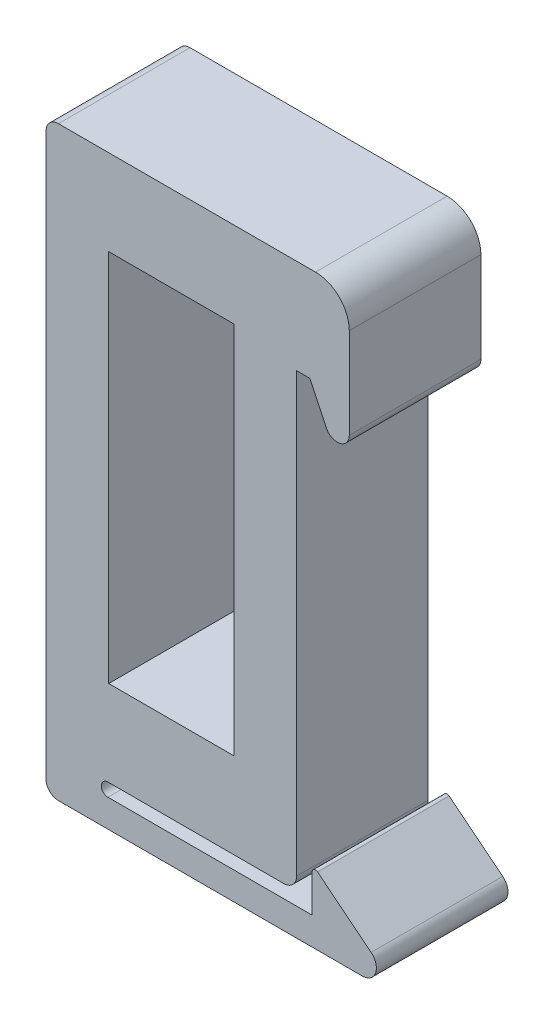
ISO-10303-21;
HEADER;
FILE_DESCRIPTION(('STEP AP214'),'2;1');
FILE_NAME('part.step','',(''),(''),'','','');
FILE_SCHEMA(('AUTOMOTIVE_DESIGN { 1 0 10303 214 1 1 1 1 }'));
ENDSEC;
DATA;
#1=APPLICATION_CONTEXT('core data for automotive mechanical design processes');
#2=APPLICATION_PROTOCOL_DEFINITION('international standard','automotive_design',2000,#1);
#3=PRODUCT_CONTEXT('',#1,'mechanical');
#4=PRODUCT('Part','Part','',(#3));
#5=PRODUCT_RELATED_PRODUCT_CATEGORY('part','',(#4));
#6=PRODUCT_DEFINITION_FORMATION('','',#4);
#7=PRODUCT_DEFINITION_CONTEXT('part definition',#1,'design');
#8=PRODUCT_DEFINITION('design','',#6,#7);
#9=PRODUCT_DEFINITION_SHAPE('','',#8);
#10=(LENGTH_UNIT() NAMED_UNIT(*) SI_UNIT(.MILLI.,.METRE.));
#11=(NAMED_UNIT(*) PLANE_ANGLE_UNIT() SI_UNIT($,.RADIAN.));
#12=(NAMED_UNIT(*) SI_UNIT($,.STERADIAN.) SOLID_ANGLE_UNIT());
#13=UNCERTAINTY_MEASURE_WITH_UNIT(LENGTH_MEASURE(1.E-05),#10,'distance_accuracy_value','');
#14=(GEOMETRIC_REPRESENTATION_CONTEXT(3) GLOBAL_UNCERTAINTY_ASSIGNED_CONTEXT((#13)) GLOBAL_UNIT_ASSIGNED_CONTEXT((#10,
#11,#12)) REPRESENTATION_CONTEXT('',''));
#15=CARTESIAN_POINT('',(0.,0.,0.));
#16=DIRECTION('',(0.,0.,1.));
#17=DIRECTION('',(1.,0.,0.));
#18=AXIS2_PLACEMENT_3D('',#15,#16,#17);
#19=CARTESIAN_POINT('',(49.7811740950623,18.6668074992488,10.));
#20=DIRECTION('',(0.,0.,-1.));
#21=DIRECTION('',(-1.,0.,0.));
#22=AXIS2_PLACEMENT_3D('',#19,#20,#21);
#23=PLANE('',#22);
#24=CARTESIAN_POINT('',(49.7811740950623,18.6668074992488,10.));
#25=DIRECTION('',(0.,0.,1.));
#26=DIRECTION('',(-1.,0.,0.));
#27=AXIS2_PLACEMENT_3D('',#24,#25,#26);
#28=CIRCLE('',#27,2.56766509573083);
#29=CARTESIAN_POINT('',(52.3488391907931,18.6668074992488,10.));
#30=VERTEX_POINT('',#29);
#31=CARTESIAN_POINT('',(49.7811740950623,21.2344725949797,10.));
#32=VERTEX_POINT('',#31);
#33=EDGE_CURVE('E226',#30,#32,#28,.T.);
#34=ORIENTED_EDGE('',*,*,#33,.T.);
#35=DIRECTION('',(-1.,0.,0.));
#36=VECTOR('',#35,1.);
#37=CARTESIAN_POINT('',(49.7811740950623,21.2344725949797,10.));
#38=LINE('',#37,#36);
#39=CARTESIAN_POINT('',(30.2464223580135,21.2344725949797,10.));
#40=VERTEX_POINT('',#39);
#41=EDGE_CURVE('E229',#32,#40,#38,.T.);
#42=ORIENTED_EDGE('',*,*,#41,.T.);
#43=CARTESIAN_POINT('',(30.2464223580134,20.2944725949797,10.));
#44=DIRECTION('',(0.,0.,1.));
#45=DIRECTION('',(-1.,0.,0.));
#46=AXIS2_PLACEMENT_3D('',#43,#44,#45);
#47=CIRCLE('',#46,0.94);
#48=CARTESIAN_POINT('',(29.3064223580134,20.2944725949797,10.));
#49=VERTEX_POINT('',#48);
#50=EDGE_CURVE('E232',#40,#49,#47,.T.);
#51=ORIENTED_EDGE('',*,*,#50,.T.);
#52=DIRECTION('',(0.,-1.,0.));
#53=VECTOR('',#52,1.);
#54=CARTESIAN_POINT('',(29.3064223580134,-22.3695921607389,10.));
#55=LINE('',#54,#53);
#56=CARTESIAN_POINT('',(29.3064223580134,-22.3695921607389,10.));
#57=VERTEX_POINT('',#56);
#58=EDGE_CURVE('E234',#49,#57,#55,.T.);
#59=ORIENTED_EDGE('',*,*,#58,.T.);
#60=CARTESIAN_POINT('',(30.2464223580135,-22.3695921607389,10.));
#61=DIRECTION('',(0.,0.,1.));
#62=DIRECTION('',(-1.,0.,0.));
#63=AXIS2_PLACEMENT_3D('',#60,#61,#62);
#64=CIRCLE('',#63,0.940000000000002);
#65=CARTESIAN_POINT('',(30.2464223580135,-23.3095921607389,10.));
#66=VERTEX_POINT('',#65);
#67=EDGE_CURVE('E236',#57,#66,#64,.T.);
#68=ORIENTED_EDGE('',*,*,#67,.T.);
#69=DIRECTION('',(1.,0.,0.));
#70=VECTOR('',#69,1.);
#71=CARTESIAN_POINT('',(53.3430401779348,-23.3095921607389,10.));
#72=LINE('',#71,#70);
#73=CARTESIAN_POINT('',(53.3430401779348,-23.3095921607389,10.));
#74=VERTEX_POINT('',#73);
#75=EDGE_CURVE('E238',#66,#74,#72,.T.);
#76=ORIENTED_EDGE('',*,*,#75,.T.);
#77=CARTESIAN_POINT('',(53.3430401779348,-22.245509760747,10.));
#78=DIRECTION('',(0.,0.,1.));
#79=DIRECTION('',(1.,0.,0.));
#80=AXIS2_PLACEMENT_3D('',#77,#78,#79);
#81=CIRCLE('',#80,1.06408239999195);
#82=CARTESIAN_POINT('',(54.0077665239454,-21.4146004763531,10.));
#83=VERTEX_POINT('',#82);
#84=EDGE_CURVE('E240',#74,#83,#81,.T.);
#85=ORIENTED_EDGE('',*,*,#84,.T.);
#86=DIRECTION('',(-0.780869305234418,0.624694427814686,0.));
#87=VECTOR('',#86,1.);
#88=CARTESIAN_POINT('',(54.0077665239454,-21.4146004763531,10.));
#89=LINE('',#88,#87);
#90=CARTESIAN_POINT('',(49.9373464974863,-18.1582697532099,10.));
#91=VERTEX_POINT('',#90);
#92=EDGE_CURVE('E242',#83,#91,#89,.T.);
#93=ORIENTED_EDGE('',*,*,#92,.T.);
#94=CARTESIAN_POINT('',(49.7811740950623,-18.3534855738539,10.));
#95=DIRECTION('',(0.,0.,1.));
#96=DIRECTION('',(-1.,0.,0.));
#97=AXIS2_PLACEMENT_3D('',#94,#95,#96);
#98=CIRCLE('',#97,0.249998071809792);
#99=CARTESIAN_POINT('',(49.5311760232525,-18.3534855738539,10.));
#100=VERTEX_POINT('',#99);
#101=EDGE_CURVE('E244',#91,#100,#98,.T.);
#102=ORIENTED_EDGE('',*,*,#101,.T.);
#103=DIRECTION('',(0.,-1.,0.));
#104=VECTOR('',#103,1.);
#105=CARTESIAN_POINT('',(49.5311760232525,-21.2061947275771,10.));
#106=LINE('',#105,#104);
#107=CARTESIAN_POINT('',(49.5311760232525,-21.2061947275771,10.));
#108=VERTEX_POINT('',#107);
#109=EDGE_CURVE('E246',#100,#108,#106,.T.);
#110=ORIENTED_EDGE('',*,*,#109,.T.);
#111=DIRECTION('',(-1.,0.,0.));
#112=VECTOR('',#111,1.);
#113=CARTESIAN_POINT('',(49.5311760232525,-21.2061947275771,10.));
#114=LINE('',#113,#112);
#115=CARTESIAN_POINT('',(34.0066171767922,-21.2061947275771,10.));
#116=VERTEX_POINT('',#115);
#117=EDGE_CURVE('E248',#108,#116,#114,.T.);
#118=ORIENTED_EDGE('',*,*,#117,.T.);
#119=CARTESIAN_POINT('',(34.0066171767922,-20.7061957275771,10.));
#120=DIRECTION('',(0.,0.,-1.));
#121=DIRECTION('',(1.,0.,0.));
#122=AXIS2_PLACEMENT_3D('',#119,#120,#121);
#123=CIRCLE('',#122,0.499999000000004);
#124=CARTESIAN_POINT('',(34.0066171767922,-20.2061967275771,10.));
#125=VERTEX_POINT('',#124);
#126=EDGE_CURVE('E250',#116,#125,#123,.T.);
#127=ORIENTED_EDGE('',*,*,#126,.T.);
#128=DIRECTION('',(1.,0.,0.));
#129=VECTOR('',#128,1.);
#130=CARTESIAN_POINT('',(34.0066171767922,-20.2061967275771,10.));
#131=LINE('',#130,#129);
#132=CARTESIAN_POINT('',(47.3688391907911,-20.2061967275771,10.));
#133=VERTEX_POINT('',#132);
#134=EDGE_CURVE('E252',#125,#133,#131,.T.);
#135=ORIENTED_EDGE('',*,*,#134,.T.);
#136=CARTESIAN_POINT('',(47.3688391907911,-19.226196727576,10.));
#137=DIRECTION('',(0.,0.,1.));
#138=DIRECTION('',(1.,0.,0.));
#139=AXIS2_PLACEMENT_3D('',#136,#137,#138);
#140=CIRCLE('',#139,0.980000000001027);
#141=CARTESIAN_POINT('',(48.3488391907921,-19.226196727576,10.));
#142=VERTEX_POINT('',#141);
#143=EDGE_CURVE('E254',#133,#142,#140,.T.);
#144=ORIENTED_EDGE('',*,*,#143,.T.);
#145=DIRECTION('',(0.,1.,0.));
#146=VECTOR('',#145,1.);
#147=CARTESIAN_POINT('',(48.3488391907921,-19.226196727576,10.));
#148=LINE('',#147,#146);
#149=CARTESIAN_POINT('',(48.3488391907921,14.0313691365042,10.));
#150=VERTEX_POINT('',#149);
#151=EDGE_CURVE('E256',#142,#150,#148,.T.);
#152=ORIENTED_EDGE('',*,*,#151,.T.);
#153=DIRECTION('',(1.,0.,0.));
#154=VECTOR('',#153,1.);
#155=CARTESIAN_POINT('',(48.3488391907921,14.0313691365042,10.));
#156=LINE('',#155,#154);
#157=CARTESIAN_POINT('',(49.348838236102,14.0313691365042,10.));
#158=VERTEX_POINT('',#157);
#159=EDGE_CURVE('E258',#150,#158,#156,.T.);
#160=ORIENTED_EDGE('',*,*,#159,.T.);
#161=DIRECTION('',(0.430782593646307,-0.90245573687099,0.));
#162=VECTOR('',#161,1.);
#163=CARTESIAN_POINT('',(49.348838236102,14.0313691365042,10.));
#164=LINE('',#163,#162);
#165=CARTESIAN_POINT('',(50.6107328158839,11.3877989931256,10.));
#166=VERTEX_POINT('',#165);
#167=EDGE_CURVE('E260',#158,#166,#164,.T.);
#168=ORIENTED_EDGE('',*,*,#167,.T.);
#169=CARTESIAN_POINT('',(51.4352271990798,11.7813671365022,10.));
#170=DIRECTION('',(0.,0.,1.));
#171=DIRECTION('',(1.,0.,0.));
#172=AXIS2_PLACEMENT_3D('',#169,#170,#171);
#173=CIRCLE('',#172,0.91361199171337);
#174=CARTESIAN_POINT('',(52.3488391907931,11.7813671365022,10.));
#175=VERTEX_POINT('',#174);
#176=EDGE_CURVE('E262',#166,#175,#173,.T.);
#177=ORIENTED_EDGE('',*,*,#176,.T.);
#178=DIRECTION('',(0.,1.,0.));
#179=VECTOR('',#178,1.);
#180=CARTESIAN_POINT('',(52.3488391907931,18.6668074992488,10.));
#181=LINE('',#180,#179);
#182=EDGE_CURVE('E264',#175,#30,#181,.T.);
#183=ORIENTED_EDGE('',*,*,#182,.T.);
#184=EDGE_LOOP('',(#34,#42,#51,#59,#68,#76,#85,#93,#102,#110,#118,#127,#135,#144,#152,#160,#168,
#177,#183));
#185=FACE_BOUND('',#184,.T.);
#186=DIRECTION('',(0.,1.,0.));
#187=VECTOR('',#186,1.);
#188=CARTESIAN_POINT('',(43.5863391907921,-13.6944765462048,10.));
#189=LINE('',#188,#187);
#190=CARTESIAN_POINT('',(43.5863391907921,-13.6944765462048,10.));
#191=VERTEX_POINT('',#190);
#192=CARTESIAN_POINT('',(43.5863391907921,14.7244725949797,10.));
#193=VERTEX_POINT('',#192);
#194=EDGE_CURVE('E188',#191,#193,#189,.T.);
#195=ORIENTED_EDGE('',*,*,#194,.F.);
#196=DIRECTION('',(1.,0.,0.));
#197=VECTOR('',#196,1.);
#198=CARTESIAN_POINT('',(34.0689223580134,-13.6944765462048,10.));
#199=LINE('',#198,#197);
#200=CARTESIAN_POINT('',(34.0689223580134,-13.6944765462048,10.));
#201=VERTEX_POINT('',#200);
#202=EDGE_CURVE('E210',#201,#191,#199,.T.);
#203=ORIENTED_EDGE('',*,*,#202,.F.);
#204=DIRECTION('',(0.,-1.,0.));
#205=VECTOR('',#204,1.);
#206=CARTESIAN_POINT('',(34.0689223580134,-13.6944765462048,10.));
#207=LINE('',#206,#205);
#208=CARTESIAN_POINT('',(34.0689223580134,14.7244725949797,10.));
#209=VERTEX_POINT('',#208);
#210=EDGE_CURVE('E208',#209,#201,#207,.T.);
#211=ORIENTED_EDGE('',*,*,#210,.F.);
#212=DIRECTION('',(-1.,0.,0.));
#213=VECTOR('',#212,1.);
#214=CARTESIAN_POINT('',(34.0689223580134,14.7244725949797,10.));
#215=LINE('',#214,#213);
#216=EDGE_CURVE('E196',#193,#209,#215,.T.);
#217=ORIENTED_EDGE('',*,*,#216,.F.);
#218=EDGE_LOOP('',(#195,#203,#211,#217));
#219=FACE_BOUND('',#218,.T.);
#220=ADVANCED_FACE('F33',(#185,#219),#23,.F.);
#221=CARTESIAN_POINT('',(49.7811740950623,18.6668074992488,0.));
#222=DIRECTION('',(0.,0.,-1.));
#223=DIRECTION('',(-1.,0.,0.));
#224=AXIS2_PLACEMENT_3D('',#221,#222,#223);
#225=PLANE('',#224);
#226=CARTESIAN_POINT('',(49.7811740950623,18.6668074992488,0.));
#227=DIRECTION('',(0.,0.,1.));
#228=DIRECTION('',(-1.,0.,0.));
#229=AXIS2_PLACEMENT_3D('',#226,#227,#228);
#230=CIRCLE('',#229,2.56766509573083);
#231=CARTESIAN_POINT('',(52.3488391907931,18.6668074992488,0.));
#232=VERTEX_POINT('',#231);
#233=CARTESIAN_POINT('',(49.7811740950623,21.2344725949797,0.));
#234=VERTEX_POINT('',#233);
#235=EDGE_CURVE('E204',#232,#234,#230,.T.);
#236=ORIENTED_EDGE('',*,*,#235,.F.);
#237=DIRECTION('',(0.,1.,0.));
#238=VECTOR('',#237,1.);
#239=CARTESIAN_POINT('',(52.3488391907931,18.6668074992488,0.));
#240=LINE('',#239,#238);
#241=CARTESIAN_POINT('',(52.3488391907931,11.7813671365022,0.));
#242=VERTEX_POINT('',#241);
#243=EDGE_CURVE('E230',#242,#232,#240,.T.);
#244=ORIENTED_EDGE('',*,*,#243,.F.);
#245=CARTESIAN_POINT('',(51.4352271990798,11.7813671365022,0.));
#246=DIRECTION('',(0.,0.,1.));
#247=DIRECTION('',(1.,0.,0.));
#248=AXIS2_PLACEMENT_3D('',#245,#246,#247);
#249=CIRCLE('',#248,0.91361199171337);
#250=CARTESIAN_POINT('',(50.6107328158839,11.3877989931256,0.));
#251=VERTEX_POINT('',#250);
#252=EDGE_CURVE('E301',#251,#242,#249,.T.);
#253=ORIENTED_EDGE('',*,*,#252,.F.);
#254=DIRECTION('',(0.430782593646307,-0.90245573687099,0.));
#255=VECTOR('',#254,1.);
#256=CARTESIAN_POINT('',(49.348838236102,14.0313691365042,0.));
#257=LINE('',#256,#255);
#258=CARTESIAN_POINT('',(49.348838236102,14.0313691365042,0.));
#259=VERTEX_POINT('',#258);
#260=EDGE_CURVE('E299',#259,#251,#257,.T.);
#261=ORIENTED_EDGE('',*,*,#260,.F.);
#262=DIRECTION('',(1.,0.,0.));
#263=VECTOR('',#262,1.);
#264=CARTESIAN_POINT('',(48.3488391907921,14.0313691365042,0.));
#265=LINE('',#264,#263);
#266=CARTESIAN_POINT('',(48.3488391907921,14.0313691365042,0.));
#267=VERTEX_POINT('',#266);
#268=EDGE_CURVE('E297',#267,#259,#265,.T.);
#269=ORIENTED_EDGE('',*,*,#268,.F.);
#270=DIRECTION('',(0.,1.,0.));
#271=VECTOR('',#270,1.);
#272=CARTESIAN_POINT('',(48.3488391907921,-19.226196727576,0.));
#273=LINE('',#272,#271);
#274=CARTESIAN_POINT('',(48.3488391907921,-19.226196727576,0.));
#275=VERTEX_POINT('',#274);
#276=EDGE_CURVE('E295',#275,#267,#273,.T.);
#277=ORIENTED_EDGE('',*,*,#276,.F.);
#278=CARTESIAN_POINT('',(47.3688391907911,-19.226196727576,0.));
#279=DIRECTION('',(0.,0.,1.));
#280=DIRECTION('',(1.,0.,0.));
#281=AXIS2_PLACEMENT_3D('',#278,#279,#280);
#282=CIRCLE('',#281,0.980000000001027);
#283=CARTESIAN_POINT('',(47.3688391907911,-20.2061967275771,0.));
#284=VERTEX_POINT('',#283);
#285=EDGE_CURVE('E293',#284,#275,#282,.T.);
#286=ORIENTED_EDGE('',*,*,#285,.F.);
#287=DIRECTION('',(1.,0.,0.));
#288=VECTOR('',#287,1.);
#289=CARTESIAN_POINT('',(34.0066171767922,-20.2061967275771,0.));
#290=LINE('',#289,#288);
#291=CARTESIAN_POINT('',(34.0066171767922,-20.2061967275771,0.));
#292=VERTEX_POINT('',#291);
#293=EDGE_CURVE('E291',#292,#284,#290,.T.);
#294=ORIENTED_EDGE('',*,*,#293,.F.);
#295=CARTESIAN_POINT('',(34.0066171767922,-20.7061957275771,0.));
#296=DIRECTION('',(0.,0.,-1.));
#297=DIRECTION('',(1.,0.,0.));
#298=AXIS2_PLACEMENT_3D('',#295,#296,#297);
#299=CIRCLE('',#298,0.499999000000004);
#300=CARTESIAN_POINT('',(34.0066171767922,-21.2061947275771,0.));
#301=VERTEX_POINT('',#300);
#302=EDGE_CURVE('E289',#301,#292,#299,.T.);
#303=ORIENTED_EDGE('',*,*,#302,.F.);
#304=DIRECTION('',(-1.,0.,0.));
#305=VECTOR('',#304,1.);
#306=CARTESIAN_POINT('',(49.5311760232525,-21.2061947275771,0.));
#307=LINE('',#306,#305);
#308=CARTESIAN_POINT('',(49.5311760232525,-21.2061947275771,0.));
#309=VERTEX_POINT('',#308);
#310=EDGE_CURVE('E287',#309,#301,#307,.T.);
#311=ORIENTED_EDGE('',*,*,#310,.F.);
#312=DIRECTION('',(0.,-1.,0.));
#313=VECTOR('',#312,1.);
#314=CARTESIAN_POINT('',(49.5311760232525,-21.2061947275771,0.));
#315=LINE('',#314,#313);
#316=CARTESIAN_POINT('',(49.5311760232525,-18.3534855738539,0.));
#317=VERTEX_POINT('',#316);
#318=EDGE_CURVE('E285',#317,#309,#315,.T.);
#319=ORIENTED_EDGE('',*,*,#318,.F.);
#320=CARTESIAN_POINT('',(49.7811740950623,-18.3534855738539,0.));
#321=DIRECTION('',(0.,0.,1.));
#322=DIRECTION('',(-1.,0.,0.));
#323=AXIS2_PLACEMENT_3D('',#320,#321,#322);
#324=CIRCLE('',#323,0.249998071809792);
#325=CARTESIAN_POINT('',(49.9373464974863,-18.1582697532099,0.));
#326=VERTEX_POINT('',#325);
#327=EDGE_CURVE('E283',#326,#317,#324,.T.);
#328=ORIENTED_EDGE('',*,*,#327,.F.);
#329=DIRECTION('',(-0.780869305234418,0.624694427814686,0.));
#330=VECTOR('',#329,1.);
#331=CARTESIAN_POINT('',(54.0077665239454,-21.4146004763531,0.));
#332=LINE('',#331,#330);
#333=CARTESIAN_POINT('',(54.0077665239454,-21.4146004763531,0.));
#334=VERTEX_POINT('',#333);
#335=EDGE_CURVE('E281',#334,#326,#332,.T.);
#336=ORIENTED_EDGE('',*,*,#335,.F.);
#337=CARTESIAN_POINT('',(53.3430401779348,-22.245509760747,0.));
#338=DIRECTION('',(0.,0.,1.));
#339=DIRECTION('',(1.,0.,0.));
#340=AXIS2_PLACEMENT_3D('',#337,#338,#339);
#341=CIRCLE('',#340,1.06408239999195);
#342=CARTESIAN_POINT('',(53.3430401779348,-23.3095921607389,0.));
#343=VERTEX_POINT('',#342);
#344=EDGE_CURVE('E279',#343,#334,#341,.T.);
#345=ORIENTED_EDGE('',*,*,#344,.F.);
#346=DIRECTION('',(1.,0.,0.));
#347=VECTOR('',#346,1.);
#348=CARTESIAN_POINT('',(53.3430401779348,-23.3095921607389,0.));
#349=LINE('',#348,#347);
#350=CARTESIAN_POINT('',(30.2464223580135,-23.3095921607389,0.));
#351=VERTEX_POINT('',#350);
#352=EDGE_CURVE('E277',#351,#343,#349,.T.);
#353=ORIENTED_EDGE('',*,*,#352,.F.);
#354=CARTESIAN_POINT('',(30.2464223580135,-22.3695921607389,0.));
#355=DIRECTION('',(0.,0.,1.));
#356=DIRECTION('',(-1.,0.,0.));
#357=AXIS2_PLACEMENT_3D('',#354,#355,#356);
#358=CIRCLE('',#357,0.940000000000002);
#359=CARTESIAN_POINT('',(29.3064223580134,-22.3695921607389,0.));
#360=VERTEX_POINT('',#359);
#361=EDGE_CURVE('E275',#360,#351,#358,.T.);
#362=ORIENTED_EDGE('',*,*,#361,.F.);
#363=DIRECTION('',(0.,-1.,0.));
#364=VECTOR('',#363,1.);
#365=CARTESIAN_POINT('',(29.3064223580134,-22.3695921607389,0.));
#366=LINE('',#365,#364);
#367=CARTESIAN_POINT('',(29.3064223580134,20.2944725949797,0.));
#368=VERTEX_POINT('',#367);
#369=EDGE_CURVE('E273',#368,#360,#366,.T.);
#370=ORIENTED_EDGE('',*,*,#369,.F.);
#371=CARTESIAN_POINT('',(30.2464223580134,20.2944725949797,0.));
#372=DIRECTION('',(0.,0.,1.));
#373=DIRECTION('',(-1.,0.,0.));
#374=AXIS2_PLACEMENT_3D('',#371,#372,#373);
#375=CIRCLE('',#374,0.94);
#376=CARTESIAN_POINT('',(30.2464223580135,21.2344725949797,0.));
#377=VERTEX_POINT('',#376);
#378=EDGE_CURVE('E271',#377,#368,#375,.T.);
#379=ORIENTED_EDGE('',*,*,#378,.F.);
#380=DIRECTION('',(-1.,0.,0.));
#381=VECTOR('',#380,1.);
#382=CARTESIAN_POINT('',(49.7811740950623,21.2344725949797,0.));
#383=LINE('',#382,#381);
#384=EDGE_CURVE('E269',#234,#377,#383,.T.);
#385=ORIENTED_EDGE('',*,*,#384,.F.);
#386=EDGE_LOOP('',(#236,#244,#253,#261,#269,#277,#286,#294,#303,#311,#319,#328,#336,#345,#353,
#362,#370,#379,#385));
#387=FACE_BOUND('',#386,.T.);
#388=DIRECTION('',(1.,0.,0.));
#389=VECTOR('',#388,1.);
#390=CARTESIAN_POINT('',(34.0689223580134,-13.6944765462048,0.));
#391=LINE('',#390,#389);
#392=CARTESIAN_POINT('',(34.0689223580134,-13.6944765462048,0.));
#393=VERTEX_POINT('',#392);
#394=CARTESIAN_POINT('',(43.5863391907921,-13.6944765462048,0.));
#395=VERTEX_POINT('',#394);
#396=EDGE_CURVE('E197',#393,#395,#391,.T.);
#397=ORIENTED_EDGE('',*,*,#396,.T.);
#398=DIRECTION('',(0.,1.,0.));
#399=VECTOR('',#398,1.);
#400=CARTESIAN_POINT('',(43.5863391907921,-13.6944765462048,0.));
#401=LINE('',#400,#399);
#402=CARTESIAN_POINT('',(43.5863391907921,14.7244725949797,0.));
#403=VERTEX_POINT('',#402);
#404=EDGE_CURVE('E56',#395,#403,#401,.T.);
#405=ORIENTED_EDGE('',*,*,#404,.T.);
#406=DIRECTION('',(-1.,0.,0.));
#407=VECTOR('',#406,1.);
#408=CARTESIAN_POINT('',(34.0689223580134,14.7244725949797,0.));
#409=LINE('',#408,#407);
#410=CARTESIAN_POINT('',(34.0689223580134,14.7244725949797,0.));
#411=VERTEX_POINT('',#410);
#412=EDGE_CURVE('E203',#403,#411,#409,.T.);
#413=ORIENTED_EDGE('',*,*,#412,.T.);
#414=DIRECTION('',(0.,-1.,0.));
#415=VECTOR('',#414,1.);
#416=CARTESIAN_POINT('',(34.0689223580134,-13.6944765462048,0.));
#417=LINE('',#416,#415);
#418=EDGE_CURVE('E218',#411,#393,#417,.T.);
#419=ORIENTED_EDGE('',*,*,#418,.T.);
#420=EDGE_LOOP('',(#397,#405,#413,#419));
#421=FACE_BOUND('',#420,.T.);
#422=ADVANCED_FACE('F364',(#387,#421),#225,.T.);
#423=CARTESIAN_POINT('',(49.7811740950623,18.6668074992488,10.));
#424=DIRECTION('',(0.,0.,-1.));
#425=DIRECTION('',(-1.,0.,0.));
#426=AXIS2_PLACEMENT_3D('',#423,#424,#425);
#427=CYLINDRICAL_SURFACE('',#426,2.56766509573083);
#428=ORIENTED_EDGE('',*,*,#235,.T.);
#429=DIRECTION('',(0.,0.,-1.));
#430=VECTOR('',#429,1.);
#431=CARTESIAN_POINT('',(49.7811740950623,21.2344725949797,10.));
#432=LINE('',#431,#430);
#433=EDGE_CURVE('E11',#32,#234,#432,.T.);
#434=ORIENTED_EDGE('',*,*,#433,.F.);
#435=ORIENTED_EDGE('',*,*,#33,.F.);
#436=DIRECTION('',(0.,0.,-1.));
#437=VECTOR('',#436,1.);
#438=CARTESIAN_POINT('',(52.3488391907931,18.6668074992488,10.));
#439=LINE('',#438,#437);
#440=EDGE_CURVE('E266',#30,#232,#439,.T.);
#441=ORIENTED_EDGE('',*,*,#440,.T.);
#442=EDGE_LOOP('',(#428,#434,#435,#441));
#443=FACE_BOUND('',#442,.T.);
#444=ADVANCED_FACE('F35',(#443),#427,.T.);
#445=CARTESIAN_POINT('',(49.7811740950623,21.2344725949797,10.));
#446=DIRECTION('',(0.,-1.,0.));
#447=DIRECTION('',(0.,0.,-1.));
#448=AXIS2_PLACEMENT_3D('',#445,#446,#447);
#449=PLANE('',#448);
#450=ORIENTED_EDGE('',*,*,#384,.T.);
#451=DIRECTION('',(0.,0.,-1.));
#452=VECTOR('',#451,1.);
#453=CARTESIAN_POINT('',(30.2464223580135,21.2344725949797,10.));
#454=LINE('',#453,#452);
#455=EDGE_CURVE('E41',#40,#377,#454,.T.);
#456=ORIENTED_EDGE('',*,*,#455,.F.);
#457=ORIENTED_EDGE('',*,*,#41,.F.);
#458=ORIENTED_EDGE('',*,*,#433,.T.);
#459=EDGE_LOOP('',(#450,#456,#457,#458));
#460=FACE_BOUND('',#459,.T.);
#461=ADVANCED_FACE('F381',(#460),#449,.F.);
#462=CARTESIAN_POINT('',(30.2464223580134,20.2944725949797,10.));
#463=DIRECTION('',(0.,0.,-1.));
#464=DIRECTION('',(-1.,0.,0.));
#465=AXIS2_PLACEMENT_3D('',#462,#463,#464);
#466=CYLINDRICAL_SURFACE('',#465,0.94);
#467=ORIENTED_EDGE('',*,*,#378,.T.);
#468=DIRECTION('',(0.,0.,-1.));
#469=VECTOR('',#468,1.);
#470=CARTESIAN_POINT('',(29.3064223580134,20.2944725949797,10.));
#471=LINE('',#470,#469);
#472=EDGE_CURVE('E351',#49,#368,#471,.T.);
#473=ORIENTED_EDGE('',*,*,#472,.F.);
#474=ORIENTED_EDGE('',*,*,#50,.F.);
#475=ORIENTED_EDGE('',*,*,#455,.T.);
#476=EDGE_LOOP('',(#467,#473,#474,#475));
#477=FACE_BOUND('',#476,.T.);
#478=ADVANCED_FACE('F358',(#477),#466,.T.);
#479=CARTESIAN_POINT('',(29.3064223580134,-22.3695921607389,10.));
#480=DIRECTION('',(1.,0.,0.));
#481=DIRECTION('',(0.,0.,-1.));
#482=AXIS2_PLACEMENT_3D('',#479,#480,#481);
#483=PLANE('',#482);
#484=CARTESIAN_POINT('',(29.3064223580134,17.4624402171204,4.5489508628543));
#485=DIRECTION('',(-1.,0.,0.));
#486=DIRECTION('',(0.,0.,1.));
#487=AXIS2_PLACEMENT_3D('',#484,#485,#486);
#488=CIRCLE('',#487,1.13889950404804);
#489=CARTESIAN_POINT('',(29.3064223580134,17.4624402171204,5.68785036690235));
#490=VERTEX_POINT('',#489);
#491=EDGE_CURVE('E698',#490,#490,#488,.T.);
#492=ORIENTED_EDGE('',*,*,#491,.F.);
#493=EDGE_LOOP('',(#492));
#494=FACE_BOUND('',#493,.T.);
#495=CARTESIAN_POINT('',(29.3064223580134,-17.540074348748,4.55112024110568));
#496=DIRECTION('',(-1.,0.,0.));
#497=DIRECTION('',(0.,0.,1.));
#498=AXIS2_PLACEMENT_3D('',#495,#496,#497);
#499=CIRCLE('',#498,1.13889950404804);
#500=CARTESIAN_POINT('',(29.3064223580134,-17.540074348748,5.69001974515372));
#501=VERTEX_POINT('',#500);
#502=EDGE_CURVE('E701',#501,#501,#499,.T.);
#503=ORIENTED_EDGE('',*,*,#502,.F.);
#504=EDGE_LOOP('',(#503));
#505=FACE_BOUND('',#504,.T.);
#506=ORIENTED_EDGE('',*,*,#369,.T.);
#507=DIRECTION('',(0.,0.,-1.));
#508=VECTOR('',#507,1.);
#509=CARTESIAN_POINT('',(29.3064223580134,-22.3695921607389,10.));
#510=LINE('',#509,#508);
#511=EDGE_CURVE('E348',#57,#360,#510,.T.);
#512=ORIENTED_EDGE('',*,*,#511,.F.);
#513=ORIENTED_EDGE('',*,*,#58,.F.);
#514=ORIENTED_EDGE('',*,*,#472,.T.);
#515=EDGE_LOOP('',(#506,#512,#513,#514));
#516=FACE_BOUND('',#515,.T.);
#517=ADVANCED_FACE('F370',(#494,#505,#516),#483,.F.);
#518=CARTESIAN_POINT('',(30.2464223580135,-22.3695921607389,10.));
#519=DIRECTION('',(0.,0.,-1.));
#520=DIRECTION('',(-1.,0.,0.));
#521=AXIS2_PLACEMENT_3D('',#518,#519,#520);
#522=CYLINDRICAL_SURFACE('',#521,0.940000000000002);
#523=ORIENTED_EDGE('',*,*,#361,.T.);
#524=DIRECTION('',(0.,0.,-1.));
#525=VECTOR('',#524,1.);
#526=CARTESIAN_POINT('',(30.2464223580135,-23.3095921607389,10.));
#527=LINE('',#526,#525);
#528=EDGE_CURVE('E345',#66,#351,#527,.T.);
#529=ORIENTED_EDGE('',*,*,#528,.F.);
#530=ORIENTED_EDGE('',*,*,#67,.F.);
#531=ORIENTED_EDGE('',*,*,#511,.T.);
#532=EDGE_LOOP('',(#523,#529,#530,#531));
#533=FACE_BOUND('',#532,.T.);
#534=ADVANCED_FACE('F374',(#533),#522,.T.);
#535=CARTESIAN_POINT('',(53.3430401779348,-23.3095921607389,10.));
#536=DIRECTION('',(0.,1.,0.));
#537=DIRECTION('',(-1.,0.,0.));
#538=AXIS2_PLACEMENT_3D('',#535,#536,#537);
#539=PLANE('',#538);
#540=ORIENTED_EDGE('',*,*,#352,.T.);
#541=DIRECTION('',(0.,0.,-1.));
#542=VECTOR('',#541,1.);
#543=CARTESIAN_POINT('',(53.3430401779348,-23.3095921607389,10.));
#544=LINE('',#543,#542);
#545=EDGE_CURVE('E342',#74,#343,#544,.T.);
#546=ORIENTED_EDGE('',*,*,#545,.F.);
#547=ORIENTED_EDGE('',*,*,#75,.F.);
#548=ORIENTED_EDGE('',*,*,#528,.T.);
#549=EDGE_LOOP('',(#540,#546,#547,#548));
#550=FACE_BOUND('',#549,.T.);
#551=ADVANCED_FACE('F449',(#550),#539,.F.);
#552=CARTESIAN_POINT('',(53.3430401779348,-22.245509760747,10.));
#553=DIRECTION('',(0.,0.,-1.));
#554=DIRECTION('',(-1.,0.,0.));
#555=AXIS2_PLACEMENT_3D('',#552,#553,#554);
#556=CYLINDRICAL_SURFACE('',#555,1.06408239999195);
#557=ORIENTED_EDGE('',*,*,#344,.T.);
#558=DIRECTION('',(0.,0.,-1.));
#559=VECTOR('',#558,1.);
#560=CARTESIAN_POINT('',(54.0077665239454,-21.4146004763531,10.));
#561=LINE('',#560,#559);
#562=EDGE_CURVE('E339',#83,#334,#561,.T.);
#563=ORIENTED_EDGE('',*,*,#562,.F.);
#564=ORIENTED_EDGE('',*,*,#84,.F.);
#565=ORIENTED_EDGE('',*,*,#545,.T.);
#566=EDGE_LOOP('',(#557,#563,#564,#565));
#567=FACE_BOUND('',#566,.T.);
#568=ADVANCED_FACE('F446',(#567),#556,.T.);
#569=CARTESIAN_POINT('',(54.0077665239454,-21.4146004763531,10.));
#570=DIRECTION('',(-0.624694427814686,-0.780869305234418,0.));
#571=DIRECTION('',(0.780869305234418,-0.624694427814686,0.));
#572=AXIS2_PLACEMENT_3D('',#569,#570,#571);
#573=PLANE('',#572);
#574=ORIENTED_EDGE('',*,*,#335,.T.);
#575=DIRECTION('',(0.,0.,-1.));
#576=VECTOR('',#575,1.);
#577=CARTESIAN_POINT('',(49.9373464974863,-18.1582697532099,10.));
#578=LINE('',#577,#576);
#579=EDGE_CURVE('E336',#91,#326,#578,.T.);
#580=ORIENTED_EDGE('',*,*,#579,.F.);
#581=ORIENTED_EDGE('',*,*,#92,.F.);
#582=ORIENTED_EDGE('',*,*,#562,.T.);
#583=EDGE_LOOP('',(#574,#580,#581,#582));
#584=FACE_BOUND('',#583,.T.);
#585=ADVANCED_FACE('F442',(#584),#573,.F.);
#586=CARTESIAN_POINT('',(49.7811740950623,-18.3534855738539,10.));
#587=DIRECTION('',(0.,0.,-1.));
#588=DIRECTION('',(-1.,0.,0.));
#589=AXIS2_PLACEMENT_3D('',#586,#587,#588);
#590=CYLINDRICAL_SURFACE('',#589,0.249998071809792);
#591=ORIENTED_EDGE('',*,*,#327,.T.);
#592=DIRECTION('',(0.,0.,-1.));
#593=VECTOR('',#592,1.);
#594=CARTESIAN_POINT('',(49.5311760232525,-18.3534855738539,10.));
#595=LINE('',#594,#593);
#596=EDGE_CURVE('E333',#100,#317,#595,.T.);
#597=ORIENTED_EDGE('',*,*,#596,.F.);
#598=ORIENTED_EDGE('',*,*,#101,.F.);
#599=ORIENTED_EDGE('',*,*,#579,.T.);
#600=EDGE_LOOP('',(#591,#597,#598,#599));
#601=FACE_BOUND('',#600,.T.);
#602=ADVANCED_FACE('F438',(#601),#590,.T.);
#603=CARTESIAN_POINT('',(49.5311760232525,-21.2061947275771,10.));
#604=DIRECTION('',(1.,0.,0.));
#605=DIRECTION('',(0.,0.,-1.));
#606=AXIS2_PLACEMENT_3D('',#603,#604,#605);
#607=PLANE('',#606);
#608=ORIENTED_EDGE('',*,*,#318,.T.);
#609=DIRECTION('',(0.,0.,-1.));
#610=VECTOR('',#609,1.);
#611=CARTESIAN_POINT('',(49.5311760232525,-21.2061947275771,10.));
#612=LINE('',#611,#610);
#613=EDGE_CURVE('E330',#108,#309,#612,.T.);
#614=ORIENTED_EDGE('',*,*,#613,.F.);
#615=ORIENTED_EDGE('',*,*,#109,.F.);
#616=ORIENTED_EDGE('',*,*,#596,.T.);
#617=EDGE_LOOP('',(#608,#614,#615,#616));
#618=FACE_BOUND('',#617,.T.);
#619=ADVANCED_FACE('F433',(#618),#607,.F.);
#620=CARTESIAN_POINT('',(49.5311760232525,-21.2061947275771,10.));
#621=DIRECTION('',(0.,-1.,0.));
#622=DIRECTION('',(1.,0.,0.));
#623=AXIS2_PLACEMENT_3D('',#620,#621,#622);
#624=PLANE('',#623);
#625=ORIENTED_EDGE('',*,*,#310,.T.);
#626=DIRECTION('',(0.,0.,-1.));
#627=VECTOR('',#626,1.);
#628=CARTESIAN_POINT('',(34.0066171767922,-21.2061947275771,10.));
#629=LINE('',#628,#627);
#630=EDGE_CURVE('E327',#116,#301,#629,.T.);
#631=ORIENTED_EDGE('',*,*,#630,.F.);
#632=ORIENTED_EDGE('',*,*,#117,.F.);
#633=ORIENTED_EDGE('',*,*,#613,.T.);
#634=EDGE_LOOP('',(#625,#631,#632,#633));
#635=FACE_BOUND('',#634,.T.);
#636=ADVANCED_FACE('F427',(#635),#624,.F.);
#637=CARTESIAN_POINT('',(34.0066171767922,-20.7061957275771,10.));
#638=DIRECTION('',(0.,0.,-1.));
#639=DIRECTION('',(-1.,0.,0.));
#640=AXIS2_PLACEMENT_3D('',#637,#638,#639);
#641=CYLINDRICAL_SURFACE('',#640,0.499999000000004);
#642=ORIENTED_EDGE('',*,*,#302,.T.);
#643=DIRECTION('',(0.,0.,-1.));
#644=VECTOR('',#643,1.);
#645=CARTESIAN_POINT('',(34.0066171767922,-20.2061967275771,10.));
#646=LINE('',#645,#644);
#647=EDGE_CURVE('E324',#125,#292,#646,.T.);
#648=ORIENTED_EDGE('',*,*,#647,.F.);
#649=ORIENTED_EDGE('',*,*,#126,.F.);
#650=ORIENTED_EDGE('',*,*,#630,.T.);
#651=EDGE_LOOP('',(#642,#648,#649,#650));
#652=FACE_BOUND('',#651,.T.);
#653=ADVANCED_FACE('F423',(#652),#641,.F.);
#654=CARTESIAN_POINT('',(34.0066171767922,-20.2061967275771,10.));
#655=DIRECTION('',(0.,1.,0.));
#656=DIRECTION('',(-1.,0.,0.));
#657=AXIS2_PLACEMENT_3D('',#654,#655,#656);
#658=PLANE('',#657);
#659=ORIENTED_EDGE('',*,*,#293,.T.);
#660=DIRECTION('',(0.,0.,-1.));
#661=VECTOR('',#660,1.);
#662=CARTESIAN_POINT('',(47.3688391907911,-20.2061967275771,10.));
#663=LINE('',#662,#661);
#664=EDGE_CURVE('E321',#133,#284,#663,.T.);
#665=ORIENTED_EDGE('',*,*,#664,.F.);
#666=ORIENTED_EDGE('',*,*,#134,.F.);
#667=ORIENTED_EDGE('',*,*,#647,.T.);
#668=EDGE_LOOP('',(#659,#665,#666,#667));
#669=FACE_BOUND('',#668,.T.);
#670=ADVANCED_FACE('F418',(#669),#658,.F.);
#671=CARTESIAN_POINT('',(47.3688391907911,-19.226196727576,10.));
#672=DIRECTION('',(0.,0.,-1.));
#673=DIRECTION('',(-1.,0.,0.));
#674=AXIS2_PLACEMENT_3D('',#671,#672,#673);
#675=CYLINDRICAL_SURFACE('',#674,0.980000000001027);
#676=ORIENTED_EDGE('',*,*,#285,.T.);
#677=DIRECTION('',(0.,0.,-1.));
#678=VECTOR('',#677,1.);
#679=CARTESIAN_POINT('',(48.3488391907921,-19.226196727576,10.));
#680=LINE('',#679,#678);
#681=EDGE_CURVE('E318',#142,#275,#680,.T.);
#682=ORIENTED_EDGE('',*,*,#681,.F.);
#683=ORIENTED_EDGE('',*,*,#143,.F.);
#684=ORIENTED_EDGE('',*,*,#664,.T.);
#685=EDGE_LOOP('',(#676,#682,#683,#684));
#686=FACE_BOUND('',#685,.T.);
#687=ADVANCED_FACE('F412',(#686),#675,.T.);
#688=CARTESIAN_POINT('',(48.3488391907921,-19.226196727576,10.));
#689=DIRECTION('',(-1.,0.,0.));
#690=DIRECTION('',(0.,0.,1.));
#691=AXIS2_PLACEMENT_3D('',#688,#689,#690);
#692=PLANE('',#691);
#693=ORIENTED_EDGE('',*,*,#276,.T.);
#694=DIRECTION('',(0.,0.,-1.));
#695=VECTOR('',#694,1.);
#696=CARTESIAN_POINT('',(48.3488391907921,14.0313691365042,10.));
#697=LINE('',#696,#695);
#698=EDGE_CURVE('E315',#150,#267,#697,.T.);
#699=ORIENTED_EDGE('',*,*,#698,.F.);
#700=ORIENTED_EDGE('',*,*,#151,.F.);
#701=ORIENTED_EDGE('',*,*,#681,.T.);
#702=EDGE_LOOP('',(#693,#699,#700,#701));
#703=FACE_BOUND('',#702,.T.);
#704=ADVANCED_FACE('F408',(#703),#692,.F.);
#705=CARTESIAN_POINT('',(48.3488391907921,14.0313691365042,10.));
#706=DIRECTION('',(0.,1.,0.));
#707=DIRECTION('',(0.,0.,1.));
#708=AXIS2_PLACEMENT_3D('',#705,#706,#707);
#709=PLANE('',#708);
#710=ORIENTED_EDGE('',*,*,#268,.T.);
#711=DIRECTION('',(0.,0.,-1.));
#712=VECTOR('',#711,1.);
#713=CARTESIAN_POINT('',(49.348838236102,14.0313691365042,10.));
#714=LINE('',#713,#712);
#715=EDGE_CURVE('E312',#158,#259,#714,.T.);
#716=ORIENTED_EDGE('',*,*,#715,.F.);
#717=ORIENTED_EDGE('',*,*,#159,.F.);
#718=ORIENTED_EDGE('',*,*,#698,.T.);
#719=EDGE_LOOP('',(#710,#716,#717,#718));
#720=FACE_BOUND('',#719,.T.);
#721=ADVANCED_FACE('F403',(#720),#709,.F.);
#722=CARTESIAN_POINT('',(49.348838236102,14.0313691365042,10.));
#723=DIRECTION('',(0.90245573687099,0.430782593646307,0.));
#724=DIRECTION('',(-0.430782593646307,0.90245573687099,0.));
#725=AXIS2_PLACEMENT_3D('',#722,#723,#724);
#726=PLANE('',#725);
#727=ORIENTED_EDGE('',*,*,#260,.T.);
#728=DIRECTION('',(0.,0.,-1.));
#729=VECTOR('',#728,1.);
#730=CARTESIAN_POINT('',(50.6107328158839,11.3877989931256,10.));
#731=LINE('',#730,#729);
#732=EDGE_CURVE('E309',#166,#251,#731,.T.);
#733=ORIENTED_EDGE('',*,*,#732,.F.);
#734=ORIENTED_EDGE('',*,*,#167,.F.);
#735=ORIENTED_EDGE('',*,*,#715,.T.);
#736=EDGE_LOOP('',(#727,#733,#734,#735));
#737=FACE_BOUND('',#736,.T.);
#738=ADVANCED_FACE('F397',(#737),#726,.F.);
#739=CARTESIAN_POINT('',(51.4352271990798,11.7813671365022,10.));
#740=DIRECTION('',(0.,0.,-1.));
#741=DIRECTION('',(-1.,0.,0.));
#742=AXIS2_PLACEMENT_3D('',#739,#740,#741);
#743=CYLINDRICAL_SURFACE('',#742,0.91361199171337);
#744=ORIENTED_EDGE('',*,*,#252,.T.);
#745=DIRECTION('',(0.,0.,-1.));
#746=VECTOR('',#745,1.);
#747=CARTESIAN_POINT('',(52.3488391907931,11.7813671365022,10.));
#748=LINE('',#747,#746);
#749=EDGE_CURVE('E306',#175,#242,#748,.T.);
#750=ORIENTED_EDGE('',*,*,#749,.F.);
#751=ORIENTED_EDGE('',*,*,#176,.F.);
#752=ORIENTED_EDGE('',*,*,#732,.T.);
#753=EDGE_LOOP('',(#744,#750,#751,#752));
#754=FACE_BOUND('',#753,.T.);
#755=ADVANCED_FACE('F393',(#754),#743,.T.);
#756=CARTESIAN_POINT('',(52.3488391907931,18.6668074992488,10.));
#757=DIRECTION('',(-1.,0.,0.));
#758=DIRECTION('',(0.,-1.,0.));
#759=AXIS2_PLACEMENT_3D('',#756,#757,#758);
#760=PLANE('',#759);
#761=ORIENTED_EDGE('',*,*,#243,.T.);
#762=ORIENTED_EDGE('',*,*,#440,.F.);
#763=ORIENTED_EDGE('',*,*,#182,.F.);
#764=ORIENTED_EDGE('',*,*,#749,.T.);
#765=EDGE_LOOP('',(#761,#762,#763,#764));
#766=FACE_BOUND('',#765,.T.);
#767=ADVANCED_FACE('F388',(#766),#760,.F.);
#768=CARTESIAN_POINT('',(43.5863391907921,-13.6944765462048,10.));
#769=DIRECTION('',(-1.,0.,0.));
#770=DIRECTION('',(0.,0.,1.));
#771=AXIS2_PLACEMENT_3D('',#768,#769,#770);
#772=PLANE('',#771);
#773=ORIENTED_EDGE('',*,*,#404,.F.);
#774=DIRECTION('',(0.,0.,-1.));
#775=VECTOR('',#774,1.);
#776=CARTESIAN_POINT('',(43.5863391907921,-13.6944765462048,10.));
#777=LINE('',#776,#775);
#778=EDGE_CURVE('E192',#191,#395,#777,.T.);
#779=ORIENTED_EDGE('',*,*,#778,.F.);
#780=ORIENTED_EDGE('',*,*,#194,.T.);
#781=DIRECTION('',(0.,0.,-1.));
#782=VECTOR('',#781,1.);
#783=CARTESIAN_POINT('',(43.5863391907921,14.7244725949797,10.));
#784=LINE('',#783,#782);
#785=EDGE_CURVE('E191',#193,#403,#784,.T.);
#786=ORIENTED_EDGE('',*,*,#785,.T.);
#787=EDGE_LOOP('',(#773,#779,#780,#786));
#788=FACE_BOUND('',#787,.T.);
#789=ADVANCED_FACE('F190',(#788),#772,.T.);
#790=CARTESIAN_POINT('',(34.0689223580134,14.7244725949797,10.));
#791=DIRECTION('',(0.,-1.,0.));
#792=DIRECTION('',(0.,0.,-1.));
#793=AXIS2_PLACEMENT_3D('',#790,#791,#792);
#794=PLANE('',#793);
#795=ORIENTED_EDGE('',*,*,#412,.F.);
#796=ORIENTED_EDGE('',*,*,#785,.F.);
#797=ORIENTED_EDGE('',*,*,#216,.T.);
#798=DIRECTION('',(0.,0.,-1.));
#799=VECTOR('',#798,1.);
#800=CARTESIAN_POINT('',(34.0689223580134,14.7244725949797,10.));
#801=LINE('',#800,#799);
#802=EDGE_CURVE('E205',#209,#411,#801,.T.);
#803=ORIENTED_EDGE('',*,*,#802,.T.);
#804=EDGE_LOOP('',(#795,#796,#797,#803));
#805=FACE_BOUND('',#804,.T.);
#806=ADVANCED_FACE('F200',(#805),#794,.T.);
#807=CARTESIAN_POINT('',(34.0689223580134,-13.6944765462048,10.));
#808=DIRECTION('',(1.,0.,0.));
#809=DIRECTION('',(0.,0.,-1.));
#810=AXIS2_PLACEMENT_3D('',#807,#808,#809);
#811=PLANE('',#810);
#812=ORIENTED_EDGE('',*,*,#418,.F.);
#813=ORIENTED_EDGE('',*,*,#802,.F.);
#814=ORIENTED_EDGE('',*,*,#210,.T.);
#815=DIRECTION('',(0.,0.,-1.));
#816=VECTOR('',#815,1.);
#817=CARTESIAN_POINT('',(34.0689223580134,-13.6944765462048,10.));
#818=LINE('',#817,#816);
#819=EDGE_CURVE('E48',#201,#393,#818,.T.);
#820=ORIENTED_EDGE('',*,*,#819,.T.);
#821=EDGE_LOOP('',(#812,#813,#814,#820));
#822=FACE_BOUND('',#821,.T.);
#823=ADVANCED_FACE('F549',(#822),#811,.T.);
#824=CARTESIAN_POINT('',(34.0689223580134,-13.6944765462048,10.));
#825=DIRECTION('',(0.,1.,0.));
#826=DIRECTION('',(0.,0.,1.));
#827=AXIS2_PLACEMENT_3D('',#824,#825,#826);
#828=PLANE('',#827);
#829=ORIENTED_EDGE('',*,*,#396,.F.);
#830=ORIENTED_EDGE('',*,*,#819,.F.);
#831=ORIENTED_EDGE('',*,*,#202,.T.);
#832=ORIENTED_EDGE('',*,*,#778,.T.);
#833=EDGE_LOOP('',(#829,#830,#831,#832));
#834=FACE_BOUND('',#833,.T.);
#835=ADVANCED_FACE('F555',(#834),#828,.T.);
#836=CARTESIAN_POINT('',(39.3064223580134,-17.540074348748,4.55112024110568));
#837=DIRECTION('',(-1.,0.,0.));
#838=DIRECTION('',(0.,0.,1.));
#839=AXIS2_PLACEMENT_3D('',#836,#837,#838);
#840=CYLINDRICAL_SURFACE('',#839,1.13889950404804);
#841=CARTESIAN_POINT('',(39.3064223580134,-17.540074348748,4.55112024110568));
#842=DIRECTION('',(-1.,0.,0.));
#843=DIRECTION('',(0.,0.,1.));
#844=AXIS2_PLACEMENT_3D('',#841,#842,#843);
#845=CIRCLE('',#844,1.13889950404804);
#846=CARTESIAN_POINT('',(39.3064223580134,-17.540074348748,5.69001974515372));
#847=VERTEX_POINT('',#846);
#848=EDGE_CURVE('E703',#847,#847,#845,.T.);
#849=ORIENTED_EDGE('',*,*,#848,.F.);
#850=EDGE_LOOP('',(#849));
#851=FACE_BOUND('',#850,.T.);
#852=ORIENTED_EDGE('',*,*,#502,.T.);
#853=EDGE_LOOP('',(#852));
#854=FACE_BOUND('',#853,.T.);
#855=ADVANCED_FACE('F563',(#851,#854),#840,.F.);
#856=CARTESIAN_POINT('',(39.3064223580134,0.,0.));
#857=DIRECTION('',(-1.,0.,0.));
#858=DIRECTION('',(0.,0.,1.));
#859=AXIS2_PLACEMENT_3D('',#856,#857,#858);
#860=PLANE('',#859);
#861=ORIENTED_EDGE('',*,*,#848,.T.);
#862=EDGE_LOOP('',(#861));
#863=FACE_BOUND('',#862,.T.);
#864=ADVANCED_FACE('F571',(#863),#860,.T.);
#865=CARTESIAN_POINT('',(39.3064223580134,17.4624402171204,4.5489508628543));
#866=DIRECTION('',(-1.,0.,0.));
#867=DIRECTION('',(0.,0.,1.));
#868=AXIS2_PLACEMENT_3D('',#865,#866,#867);
#869=CYLINDRICAL_SURFACE('',#868,1.13889950404804);
#870=CARTESIAN_POINT('',(39.3064223580134,17.4624402171204,4.5489508628543));
#871=DIRECTION('',(-1.,0.,0.));
#872=DIRECTION('',(0.,0.,1.));
#873=AXIS2_PLACEMENT_3D('',#870,#871,#872);
#874=CIRCLE('',#873,1.13889950404804);
#875=CARTESIAN_POINT('',(39.3064223580134,17.4624402171204,5.68785036690235));
#876=VERTEX_POINT('',#875);
#877=EDGE_CURVE('E216',#876,#876,#874,.T.);
#878=ORIENTED_EDGE('',*,*,#877,.F.);
#879=EDGE_LOOP('',(#878));
#880=FACE_BOUND('',#879,.T.);
#881=ORIENTED_EDGE('',*,*,#491,.T.);
#882=EDGE_LOOP('',(#881));
#883=FACE_BOUND('',#882,.T.);
#884=ADVANCED_FACE('F579',(#880,#883),#869,.F.);
#885=CARTESIAN_POINT('',(39.3064223580134,0.,0.));
#886=DIRECTION('',(-1.,0.,0.));
#887=DIRECTION('',(0.,0.,1.));
#888=AXIS2_PLACEMENT_3D('',#885,#886,#887);
#889=PLANE('',#888);
#890=ORIENTED_EDGE('',*,*,#877,.T.);
#891=EDGE_LOOP('',(#890));
#892=FACE_BOUND('',#891,.T.);
#893=ADVANCED_FACE('F587',(#892),#889,.T.);
#894=CLOSED_SHELL('',(#220,#422,#444,#461,#478,#517,#534,#551,#568,#585,#602,#619,#636,#653,
#670,#687,#704,#721,#738,#755,#767,#789,#806,#823,#835,#855,#864,#884,#893));
#895=MANIFOLD_SOLID_BREP('B2',#894);
#896=ADVANCED_BREP_SHAPE_REPRESENTATION('',(#18,#895),#14);
#897=SHAPE_DEFINITION_REPRESENTATION(#9,#896);
ENDSEC;
END-ISO-10303-21;
